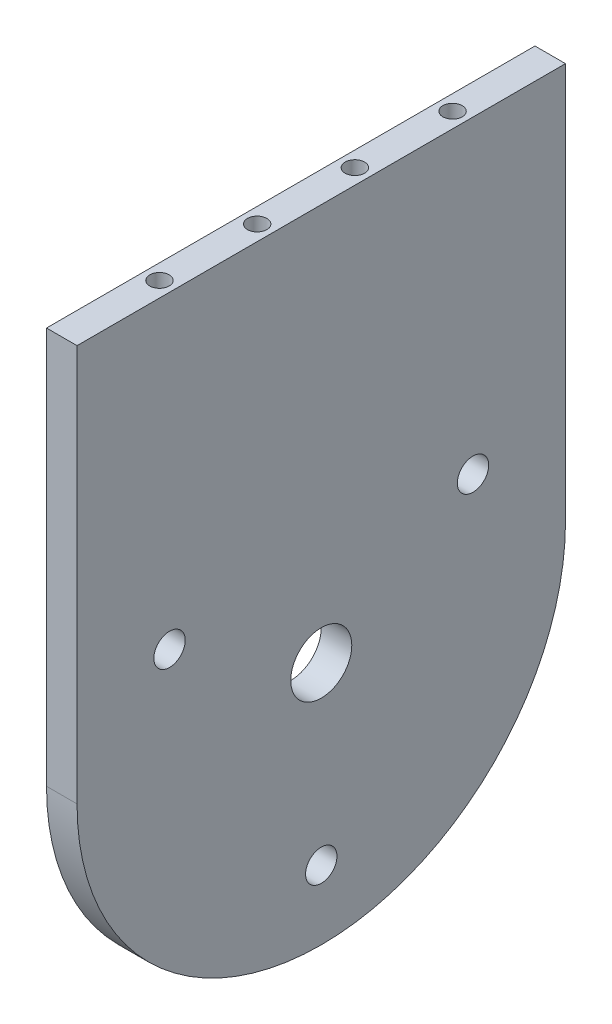
ISO-10303-21;
HEADER;
FILE_DESCRIPTION(('STEP AP214'),'2;1');
FILE_NAME('part.step','',(''),(''),'','','');
FILE_SCHEMA(('AUTOMOTIVE_DESIGN { 1 0 10303 214 1 1 1 1 }'));
ENDSEC;
DATA;
#1=APPLICATION_CONTEXT('core data for automotive mechanical design processes');
#2=APPLICATION_PROTOCOL_DEFINITION('international standard','automotive_design',2000,#1);
#3=PRODUCT_CONTEXT('',#1,'mechanical');
#4=PRODUCT('Part','Part','',(#3));
#5=PRODUCT_RELATED_PRODUCT_CATEGORY('part','',(#4));
#6=PRODUCT_DEFINITION_FORMATION('','',#4);
#7=PRODUCT_DEFINITION_CONTEXT('part definition',#1,'design');
#8=PRODUCT_DEFINITION('design','',#6,#7);
#9=PRODUCT_DEFINITION_SHAPE('','',#8);
#10=(LENGTH_UNIT() NAMED_UNIT(*) SI_UNIT(.MILLI.,.METRE.));
#11=(NAMED_UNIT(*) PLANE_ANGLE_UNIT() SI_UNIT($,.RADIAN.));
#12=(NAMED_UNIT(*) SI_UNIT($,.STERADIAN.) SOLID_ANGLE_UNIT());
#13=UNCERTAINTY_MEASURE_WITH_UNIT(LENGTH_MEASURE(1.E-05),#10,'distance_accuracy_value','');
#14=(GEOMETRIC_REPRESENTATION_CONTEXT(3) GLOBAL_UNCERTAINTY_ASSIGNED_CONTEXT((#13)) GLOBAL_UNIT_ASSIGNED_CONTEXT((#10,
#11,#12)) REPRESENTATION_CONTEXT('',''));
#15=CARTESIAN_POINT('',(0.,0.,0.));
#16=DIRECTION('',(0.,0.,1.));
#17=DIRECTION('',(1.,0.,0.));
#18=AXIS2_PLACEMENT_3D('',#15,#16,#17);
#19=CARTESIAN_POINT('',(3.175,-82.55,0.));
#20=DIRECTION('',(1.,0.,0.));
#21=DIRECTION('',(0.,0.,-1.));
#22=AXIS2_PLACEMENT_3D('',#19,#20,#21);
#23=PLANE('',#22);
#24=CARTESIAN_POINT('',(3.175,-64.3280399904669,31.5613605500002));
#25=DIRECTION('',(1.,0.,0.));
#26=DIRECTION('',(0.,0.,-1.));
#27=AXIS2_PLACEMENT_3D('',#24,#25,#26);
#28=CIRCLE('',#27,3.2639);
#29=CARTESIAN_POINT('',(3.175,-64.3280399904669,28.2974605500002));
#30=VERTEX_POINT('',#29);
#31=EDGE_CURVE('E129',#30,#30,#28,.T.);
#32=ORIENTED_EDGE('',*,*,#31,.F.);
#33=EDGE_LOOP('',(#32));
#34=FACE_BOUND('',#33,.T.);
#35=CARTESIAN_POINT('',(3.175,-64.3280399904667,-31.5613605499998));
#36=DIRECTION('',(1.,0.,0.));
#37=DIRECTION('',(0.,0.,-1.));
#38=AXIS2_PLACEMENT_3D('',#35,#36,#37);
#39=CIRCLE('',#38,3.2639);
#40=CARTESIAN_POINT('',(3.175,-64.3280399904667,-34.8252605499998));
#41=VERTEX_POINT('',#40);
#42=EDGE_CURVE('E135',#41,#41,#39,.T.);
#43=ORIENTED_EDGE('',*,*,#42,.F.);
#44=EDGE_LOOP('',(#43));
#45=FACE_BOUND('',#44,.T.);
#46=CARTESIAN_POINT('',(3.175,-118.993920019067,0.));
#47=DIRECTION('',(1.,0.,0.));
#48=DIRECTION('',(0.,0.,-1.));
#49=AXIS2_PLACEMENT_3D('',#46,#47,#48);
#50=CIRCLE('',#49,3.2639);
#51=CARTESIAN_POINT('',(3.175,-118.993920019067,-3.2639));
#52=VERTEX_POINT('',#51);
#53=EDGE_CURVE('E141',#52,#52,#50,.T.);
#54=ORIENTED_EDGE('',*,*,#53,.F.);
#55=EDGE_LOOP('',(#54));
#56=FACE_BOUND('',#55,.T.);
#57=DIRECTION('',(0.,-1.,0.));
#58=VECTOR('',#57,1.);
#59=CARTESIAN_POINT('',(3.175,0.,50.8));
#60=LINE('',#59,#58);
#61=CARTESIAN_POINT('',(3.175,0.,50.8));
#62=VERTEX_POINT('',#61);
#63=CARTESIAN_POINT('',(3.175,-82.55,50.8));
#64=VERTEX_POINT('',#63);
#65=EDGE_CURVE('E154',#62,#64,#60,.T.);
#66=ORIENTED_EDGE('',*,*,#65,.T.);
#67=CARTESIAN_POINT('',(3.175,-82.55,0.));
#68=DIRECTION('',(1.,0.,0.));
#69=DIRECTION('',(0.,0.,-1.));
#70=AXIS2_PLACEMENT_3D('',#67,#68,#69);
#71=CIRCLE('',#70,50.8);
#72=CARTESIAN_POINT('',(3.175,-82.55,-50.8));
#73=VERTEX_POINT('',#72);
#74=EDGE_CURVE('E83',#64,#73,#71,.T.);
#75=ORIENTED_EDGE('',*,*,#74,.T.);
#76=DIRECTION('',(0.,1.,0.));
#77=VECTOR('',#76,1.);
#78=CARTESIAN_POINT('',(3.175,0.,-50.8));
#79=LINE('',#78,#77);
#80=CARTESIAN_POINT('',(3.175,0.,-50.8));
#81=VERTEX_POINT('',#80);
#82=EDGE_CURVE('E157',#73,#81,#79,.T.);
#83=ORIENTED_EDGE('',*,*,#82,.T.);
#84=DIRECTION('',(0.,0.,1.));
#85=VECTOR('',#84,1.);
#86=CARTESIAN_POINT('',(3.175,0.,50.8));
#87=LINE('',#86,#85);
#88=EDGE_CURVE('E52',#81,#62,#87,.T.);
#89=ORIENTED_EDGE('',*,*,#88,.T.);
#90=EDGE_LOOP('',(#66,#75,#83,#89));
#91=FACE_BOUND('',#90,.T.);
#92=CARTESIAN_POINT('',(3.175,-82.55,0.));
#93=DIRECTION('',(1.,0.,0.));
#94=DIRECTION('',(0.,0.,-1.));
#95=AXIS2_PLACEMENT_3D('',#92,#93,#94);
#96=CIRCLE('',#95,6.34999999999999);
#97=CARTESIAN_POINT('',(3.175,-82.55,-6.34999999999999));
#98=VERTEX_POINT('',#97);
#99=EDGE_CURVE('E148',#98,#98,#96,.T.);
#100=ORIENTED_EDGE('',*,*,#99,.F.);
#101=EDGE_LOOP('',(#100));
#102=FACE_BOUND('',#101,.T.);
#103=ADVANCED_FACE('F35',(#34,#45,#56,#91,#102),#23,.T.);
#104=CARTESIAN_POINT('',(-3.175,-82.55,0.));
#105=DIRECTION('',(1.,0.,0.));
#106=DIRECTION('',(0.,0.,-1.));
#107=AXIS2_PLACEMENT_3D('',#104,#105,#106);
#108=PLANE('',#107);
#109=CARTESIAN_POINT('',(-3.175,-64.3280399904669,31.5613605500002));
#110=DIRECTION('',(1.,0.,0.));
#111=DIRECTION('',(0.,0.,-1.));
#112=AXIS2_PLACEMENT_3D('',#109,#110,#111);
#113=CIRCLE('',#112,3.2639);
#114=CARTESIAN_POINT('',(-3.175,-64.3280399904669,28.2974605500002));
#115=VERTEX_POINT('',#114);
#116=EDGE_CURVE('E132',#115,#115,#113,.T.);
#117=ORIENTED_EDGE('',*,*,#116,.T.);
#118=EDGE_LOOP('',(#117));
#119=FACE_BOUND('',#118,.T.);
#120=CARTESIAN_POINT('',(-3.175,-64.3280399904667,-31.5613605499998));
#121=DIRECTION('',(1.,0.,0.));
#122=DIRECTION('',(0.,0.,-1.));
#123=AXIS2_PLACEMENT_3D('',#120,#121,#122);
#124=CIRCLE('',#123,3.2639);
#125=CARTESIAN_POINT('',(-3.175,-64.3280399904667,-34.8252605499998));
#126=VERTEX_POINT('',#125);
#127=EDGE_CURVE('E138',#126,#126,#124,.T.);
#128=ORIENTED_EDGE('',*,*,#127,.T.);
#129=EDGE_LOOP('',(#128));
#130=FACE_BOUND('',#129,.T.);
#131=CARTESIAN_POINT('',(-3.175,-118.993920019067,0.));
#132=DIRECTION('',(1.,0.,0.));
#133=DIRECTION('',(0.,0.,-1.));
#134=AXIS2_PLACEMENT_3D('',#131,#132,#133);
#135=CIRCLE('',#134,3.2639);
#136=CARTESIAN_POINT('',(-3.175,-118.993920019067,-3.2639));
#137=VERTEX_POINT('',#136);
#138=EDGE_CURVE('E144',#137,#137,#135,.T.);
#139=ORIENTED_EDGE('',*,*,#138,.T.);
#140=EDGE_LOOP('',(#139));
#141=FACE_BOUND('',#140,.T.);
#142=DIRECTION('',(0.,-1.,0.));
#143=VECTOR('',#142,1.);
#144=CARTESIAN_POINT('',(-3.175,0.,50.8));
#145=LINE('',#144,#143);
#146=CARTESIAN_POINT('',(-3.175,0.,50.8));
#147=VERTEX_POINT('',#146);
#148=CARTESIAN_POINT('',(-3.175,-82.55,50.8));
#149=VERTEX_POINT('',#148);
#150=EDGE_CURVE('E151',#147,#149,#145,.T.);
#151=ORIENTED_EDGE('',*,*,#150,.F.);
#152=DIRECTION('',(0.,0.,1.));
#153=VECTOR('',#152,1.);
#154=CARTESIAN_POINT('',(-3.175,0.,50.8));
#155=LINE('',#154,#153);
#156=CARTESIAN_POINT('',(-3.175,0.,-50.8));
#157=VERTEX_POINT('',#156);
#158=EDGE_CURVE('E76',#157,#147,#155,.T.);
#159=ORIENTED_EDGE('',*,*,#158,.F.);
#160=DIRECTION('',(0.,1.,0.));
#161=VECTOR('',#160,1.);
#162=CARTESIAN_POINT('',(-3.175,0.,-50.8));
#163=LINE('',#162,#161);
#164=CARTESIAN_POINT('',(-3.175,-82.55,-50.8));
#165=VERTEX_POINT('',#164);
#166=EDGE_CURVE('E70',#165,#157,#163,.T.);
#167=ORIENTED_EDGE('',*,*,#166,.F.);
#168=CARTESIAN_POINT('',(-3.175,-82.55,0.));
#169=DIRECTION('',(1.,0.,0.));
#170=DIRECTION('',(0.,0.,-1.));
#171=AXIS2_PLACEMENT_3D('',#168,#169,#170);
#172=CIRCLE('',#171,50.8);
#173=EDGE_CURVE('E163',#149,#165,#172,.T.);
#174=ORIENTED_EDGE('',*,*,#173,.F.);
#175=EDGE_LOOP('',(#151,#159,#167,#174));
#176=FACE_BOUND('',#175,.T.);
#177=CARTESIAN_POINT('',(-3.175,-82.55,0.));
#178=DIRECTION('',(1.,0.,0.));
#179=DIRECTION('',(0.,0.,-1.));
#180=AXIS2_PLACEMENT_3D('',#177,#178,#179);
#181=CIRCLE('',#180,6.34999999999999);
#182=CARTESIAN_POINT('',(-3.175,-82.55,-6.34999999999999));
#183=VERTEX_POINT('',#182);
#184=EDGE_CURVE('E147',#183,#183,#181,.T.);
#185=ORIENTED_EDGE('',*,*,#184,.T.);
#186=EDGE_LOOP('',(#185));
#187=FACE_BOUND('',#186,.T.);
#188=ADVANCED_FACE('F173',(#119,#130,#141,#176,#187),#108,.F.);
#189=CARTESIAN_POINT('',(3.175,0.,50.8));
#190=DIRECTION('',(0.,0.,-1.));
#191=DIRECTION('',(0.,1.,0.));
#192=AXIS2_PLACEMENT_3D('',#189,#190,#191);
#193=PLANE('',#192);
#194=ORIENTED_EDGE('',*,*,#150,.T.);
#195=DIRECTION('',(-1.,0.,0.));
#196=VECTOR('',#195,1.);
#197=CARTESIAN_POINT('',(3.175,-82.55,50.8));
#198=LINE('',#197,#196);
#199=EDGE_CURVE('E11',#64,#149,#198,.T.);
#200=ORIENTED_EDGE('',*,*,#199,.F.);
#201=ORIENTED_EDGE('',*,*,#65,.F.);
#202=DIRECTION('',(-1.,0.,0.));
#203=VECTOR('',#202,1.);
#204=CARTESIAN_POINT('',(3.175,0.,50.8));
#205=LINE('',#204,#203);
#206=EDGE_CURVE('E160',#62,#147,#205,.T.);
#207=ORIENTED_EDGE('',*,*,#206,.T.);
#208=EDGE_LOOP('',(#194,#200,#201,#207));
#209=FACE_BOUND('',#208,.T.);
#210=ADVANCED_FACE('F37',(#209),#193,.F.);
#211=CARTESIAN_POINT('',(3.175,-82.55,0.));
#212=DIRECTION('',(-1.,0.,0.));
#213=DIRECTION('',(0.,0.,1.));
#214=AXIS2_PLACEMENT_3D('',#211,#212,#213);
#215=CYLINDRICAL_SURFACE('',#214,50.8);
#216=ORIENTED_EDGE('',*,*,#173,.T.);
#217=DIRECTION('',(-1.,0.,0.));
#218=VECTOR('',#217,1.);
#219=CARTESIAN_POINT('',(3.175,-82.55,-50.8));
#220=LINE('',#219,#218);
#221=EDGE_CURVE('E44',#73,#165,#220,.T.);
#222=ORIENTED_EDGE('',*,*,#221,.F.);
#223=ORIENTED_EDGE('',*,*,#74,.F.);
#224=ORIENTED_EDGE('',*,*,#199,.T.);
#225=EDGE_LOOP('',(#216,#222,#223,#224));
#226=FACE_BOUND('',#225,.T.);
#227=ADVANCED_FACE('F190',(#226),#215,.T.);
#228=CARTESIAN_POINT('',(3.175,0.,-50.8));
#229=DIRECTION('',(0.,0.,1.));
#230=DIRECTION('',(0.,-1.,0.));
#231=AXIS2_PLACEMENT_3D('',#228,#229,#230);
#232=PLANE('',#231);
#233=ORIENTED_EDGE('',*,*,#166,.T.);
#234=DIRECTION('',(-1.,0.,0.));
#235=VECTOR('',#234,1.);
#236=CARTESIAN_POINT('',(3.175,0.,-50.8));
#237=LINE('',#236,#235);
#238=EDGE_CURVE('E168',#81,#157,#237,.T.);
#239=ORIENTED_EDGE('',*,*,#238,.F.);
#240=ORIENTED_EDGE('',*,*,#82,.F.);
#241=ORIENTED_EDGE('',*,*,#221,.T.);
#242=EDGE_LOOP('',(#233,#239,#240,#241));
#243=FACE_BOUND('',#242,.T.);
#244=ADVANCED_FACE('F170',(#243),#232,.F.);
#245=CARTESIAN_POINT('',(3.175,0.,50.8));
#246=DIRECTION('',(0.,-1.,0.));
#247=DIRECTION('',(0.,0.,-1.));
#248=AXIS2_PLACEMENT_3D('',#245,#246,#247);
#249=PLANE('',#248);
#250=CARTESIAN_POINT('',(0.,0.,-30.48));
#251=DIRECTION('',(0.,1.,0.));
#252=DIRECTION('',(0.,0.,1.));
#253=AXIS2_PLACEMENT_3D('',#250,#251,#252);
#254=CIRCLE('',#253,2.01929999999999);
#255=CARTESIAN_POINT('',(0.,0.,-28.4607));
#256=VERTEX_POINT('',#255);
#257=EDGE_CURVE('E107',#256,#256,#254,.T.);
#258=ORIENTED_EDGE('',*,*,#257,.F.);
#259=EDGE_LOOP('',(#258));
#260=FACE_BOUND('',#259,.T.);
#261=CARTESIAN_POINT('',(0.,0.,-10.16));
#262=DIRECTION('',(0.,1.,0.));
#263=DIRECTION('',(0.,0.,1.));
#264=AXIS2_PLACEMENT_3D('',#261,#262,#263);
#265=CIRCLE('',#264,2.01929999999999);
#266=CARTESIAN_POINT('',(0.,0.,-8.14070000000001));
#267=VERTEX_POINT('',#266);
#268=EDGE_CURVE('E106',#267,#267,#265,.T.);
#269=ORIENTED_EDGE('',*,*,#268,.F.);
#270=EDGE_LOOP('',(#269));
#271=FACE_BOUND('',#270,.T.);
#272=CARTESIAN_POINT('',(0.,0.,10.16));
#273=DIRECTION('',(0.,1.,0.));
#274=DIRECTION('',(0.,0.,1.));
#275=AXIS2_PLACEMENT_3D('',#272,#273,#274);
#276=CIRCLE('',#275,2.01929999999999);
#277=CARTESIAN_POINT('',(0.,0.,12.1793));
#278=VERTEX_POINT('',#277);
#279=EDGE_CURVE('E117',#278,#278,#276,.T.);
#280=ORIENTED_EDGE('',*,*,#279,.F.);
#281=EDGE_LOOP('',(#280));
#282=FACE_BOUND('',#281,.T.);
#283=CARTESIAN_POINT('',(0.,0.,30.48));
#284=DIRECTION('',(0.,1.,0.));
#285=DIRECTION('',(0.,0.,1.));
#286=AXIS2_PLACEMENT_3D('',#283,#284,#285);
#287=CIRCLE('',#286,2.01929999999999);
#288=CARTESIAN_POINT('',(0.,0.,32.4993));
#289=VERTEX_POINT('',#288);
#290=EDGE_CURVE('E123',#289,#289,#287,.T.);
#291=ORIENTED_EDGE('',*,*,#290,.F.);
#292=EDGE_LOOP('',(#291));
#293=FACE_BOUND('',#292,.T.);
#294=ORIENTED_EDGE('',*,*,#158,.T.);
#295=ORIENTED_EDGE('',*,*,#206,.F.);
#296=ORIENTED_EDGE('',*,*,#88,.F.);
#297=ORIENTED_EDGE('',*,*,#238,.T.);
#298=EDGE_LOOP('',(#294,#295,#296,#297));
#299=FACE_BOUND('',#298,.T.);
#300=ADVANCED_FACE('F178',(#260,#271,#282,#293,#299),#249,.F.);
#301=CARTESIAN_POINT('',(3.175,-82.55,0.));
#302=DIRECTION('',(-1.,0.,0.));
#303=DIRECTION('',(0.,0.,1.));
#304=AXIS2_PLACEMENT_3D('',#301,#302,#303);
#305=CYLINDRICAL_SURFACE('',#304,6.34999999999999);
#306=ORIENTED_EDGE('',*,*,#99,.T.);
#307=EDGE_LOOP('',(#306));
#308=FACE_BOUND('',#307,.T.);
#309=ORIENTED_EDGE('',*,*,#184,.F.);
#310=EDGE_LOOP('',(#309));
#311=FACE_BOUND('',#310,.T.);
#312=ADVANCED_FACE('F180',(#308,#311),#305,.F.);
#313=CARTESIAN_POINT('',(3.175,-118.993920019067,0.));
#314=DIRECTION('',(1.,0.,0.));
#315=DIRECTION('',(0.,0.,-1.));
#316=AXIS2_PLACEMENT_3D('',#313,#314,#315);
#317=CYLINDRICAL_SURFACE('',#316,3.2639);
#318=ORIENTED_EDGE('',*,*,#138,.F.);
#319=EDGE_LOOP('',(#318));
#320=FACE_BOUND('',#319,.T.);
#321=ORIENTED_EDGE('',*,*,#53,.T.);
#322=EDGE_LOOP('',(#321));
#323=FACE_BOUND('',#322,.T.);
#324=ADVANCED_FACE('F187',(#320,#323),#317,.F.);
#325=CARTESIAN_POINT('',(3.175,-64.3280399904667,-31.5613605499998));
#326=DIRECTION('',(1.,0.,0.));
#327=DIRECTION('',(0.,0.,-1.));
#328=AXIS2_PLACEMENT_3D('',#325,#326,#327);
#329=CYLINDRICAL_SURFACE('',#328,3.2639);
#330=ORIENTED_EDGE('',*,*,#127,.F.);
#331=EDGE_LOOP('',(#330));
#332=FACE_BOUND('',#331,.T.);
#333=ORIENTED_EDGE('',*,*,#42,.T.);
#334=EDGE_LOOP('',(#333));
#335=FACE_BOUND('',#334,.T.);
#336=ADVANCED_FACE('F207',(#332,#335),#329,.F.);
#337=CARTESIAN_POINT('',(3.175,-64.3280399904669,31.5613605500002));
#338=DIRECTION('',(1.,0.,0.));
#339=DIRECTION('',(0.,0.,-1.));
#340=AXIS2_PLACEMENT_3D('',#337,#338,#339);
#341=CYLINDRICAL_SURFACE('',#340,3.2639);
#342=ORIENTED_EDGE('',*,*,#116,.F.);
#343=EDGE_LOOP('',(#342));
#344=FACE_BOUND('',#343,.T.);
#345=ORIENTED_EDGE('',*,*,#31,.T.);
#346=EDGE_LOOP('',(#345));
#347=FACE_BOUND('',#346,.T.);
#348=ADVANCED_FACE('F211',(#344,#347),#341,.F.);
#349=CARTESIAN_POINT('',(0.,-12.7,30.48));
#350=DIRECTION('',(0.,1.,0.));
#351=DIRECTION('',(0.,0.,1.));
#352=AXIS2_PLACEMENT_3D('',#349,#350,#351);
#353=CONICAL_SURFACE('',#352,2.0193,1.02974425867665);
#354=CARTESIAN_POINT('',(0.,-13.9133178480024,30.48));
#355=VERTEX_POINT('',#354);
#356=VERTEX_LOOP('',#355);
#357=FACE_BOUND('',#356,.T.);
#358=CARTESIAN_POINT('',(0.,-12.7,30.48));
#359=DIRECTION('',(0.,1.,0.));
#360=DIRECTION('',(0.,0.,1.));
#361=AXIS2_PLACEMENT_3D('',#358,#359,#360);
#362=CIRCLE('',#361,2.0193);
#363=CARTESIAN_POINT('',(0.,-12.7,32.4993));
#364=VERTEX_POINT('',#363);
#365=EDGE_CURVE('E126',#364,#364,#362,.T.);
#366=ORIENTED_EDGE('',*,*,#365,.T.);
#367=EDGE_LOOP('',(#366));
#368=FACE_BOUND('',#367,.T.);
#369=ADVANCED_FACE('F215',(#357,#368),#353,.F.);
#370=CARTESIAN_POINT('',(0.,0.,30.48));
#371=DIRECTION('',(0.,1.,0.));
#372=DIRECTION('',(0.,0.,1.));
#373=AXIS2_PLACEMENT_3D('',#370,#371,#372);
#374=CYLINDRICAL_SURFACE('',#373,2.01929999999999);
#375=ORIENTED_EDGE('',*,*,#365,.F.);
#376=EDGE_LOOP('',(#375));
#377=FACE_BOUND('',#376,.T.);
#378=ORIENTED_EDGE('',*,*,#290,.T.);
#379=EDGE_LOOP('',(#378));
#380=FACE_BOUND('',#379,.T.);
#381=ADVANCED_FACE('F219',(#377,#380),#374,.F.);
#382=CARTESIAN_POINT('',(0.,-12.7,10.16));
#383=DIRECTION('',(0.,1.,0.));
#384=DIRECTION('',(0.,0.,1.));
#385=AXIS2_PLACEMENT_3D('',#382,#383,#384);
#386=CONICAL_SURFACE('',#385,2.0193,1.02974425867665);
#387=CARTESIAN_POINT('',(0.,-13.9133178480024,10.16));
#388=VERTEX_POINT('',#387);
#389=VERTEX_LOOP('',#388);
#390=FACE_BOUND('',#389,.T.);
#391=CARTESIAN_POINT('',(0.,-12.7,10.16));
#392=DIRECTION('',(0.,1.,0.));
#393=DIRECTION('',(0.,0.,1.));
#394=AXIS2_PLACEMENT_3D('',#391,#392,#393);
#395=CIRCLE('',#394,2.0193);
#396=CARTESIAN_POINT('',(0.,-12.7,12.1793));
#397=VERTEX_POINT('',#396);
#398=EDGE_CURVE('E120',#397,#397,#395,.T.);
#399=ORIENTED_EDGE('',*,*,#398,.T.);
#400=EDGE_LOOP('',(#399));
#401=FACE_BOUND('',#400,.T.);
#402=ADVANCED_FACE('F223',(#390,#401),#386,.F.);
#403=CARTESIAN_POINT('',(0.,0.,10.16));
#404=DIRECTION('',(0.,1.,0.));
#405=DIRECTION('',(0.,0.,1.));
#406=AXIS2_PLACEMENT_3D('',#403,#404,#405);
#407=CYLINDRICAL_SURFACE('',#406,2.01929999999999);
#408=ORIENTED_EDGE('',*,*,#398,.F.);
#409=EDGE_LOOP('',(#408));
#410=FACE_BOUND('',#409,.T.);
#411=ORIENTED_EDGE('',*,*,#279,.T.);
#412=EDGE_LOOP('',(#411));
#413=FACE_BOUND('',#412,.T.);
#414=ADVANCED_FACE('F227',(#410,#413),#407,.F.);
#415=CARTESIAN_POINT('',(0.,-12.7,-10.16));
#416=DIRECTION('',(0.,1.,0.));
#417=DIRECTION('',(0.,0.,1.));
#418=AXIS2_PLACEMENT_3D('',#415,#416,#417);
#419=CONICAL_SURFACE('',#418,2.0193,1.02974425867665);
#420=CARTESIAN_POINT('',(0.,-13.9133178480024,-10.16));
#421=VERTEX_POINT('',#420);
#422=VERTEX_LOOP('',#421);
#423=FACE_BOUND('',#422,.T.);
#424=CARTESIAN_POINT('',(0.,-12.7,-10.16));
#425=DIRECTION('',(0.,1.,0.));
#426=DIRECTION('',(0.,0.,1.));
#427=AXIS2_PLACEMENT_3D('',#424,#425,#426);
#428=CIRCLE('',#427,2.0193);
#429=CARTESIAN_POINT('',(0.,-12.7,-8.1407));
#430=VERTEX_POINT('',#429);
#431=EDGE_CURVE('E110',#430,#430,#428,.T.);
#432=ORIENTED_EDGE('',*,*,#431,.T.);
#433=EDGE_LOOP('',(#432));
#434=FACE_BOUND('',#433,.T.);
#435=ADVANCED_FACE('F231',(#423,#434),#419,.F.);
#436=CARTESIAN_POINT('',(0.,0.,-10.16));
#437=DIRECTION('',(0.,1.,0.));
#438=DIRECTION('',(0.,0.,1.));
#439=AXIS2_PLACEMENT_3D('',#436,#437,#438);
#440=CYLINDRICAL_SURFACE('',#439,2.01929999999999);
#441=ORIENTED_EDGE('',*,*,#431,.F.);
#442=EDGE_LOOP('',(#441));
#443=FACE_BOUND('',#442,.T.);
#444=ORIENTED_EDGE('',*,*,#268,.T.);
#445=EDGE_LOOP('',(#444));
#446=FACE_BOUND('',#445,.T.);
#447=ADVANCED_FACE('F100',(#443,#446),#440,.F.);
#448=CARTESIAN_POINT('',(0.,-12.7,-30.48));
#449=DIRECTION('',(0.,1.,0.));
#450=DIRECTION('',(0.,0.,1.));
#451=AXIS2_PLACEMENT_3D('',#448,#449,#450);
#452=CONICAL_SURFACE('',#451,2.0193,1.02974425867665);
#453=CARTESIAN_POINT('',(0.,-13.9133178480024,-30.48));
#454=VERTEX_POINT('',#453);
#455=VERTEX_LOOP('',#454);
#456=FACE_BOUND('',#455,.T.);
#457=CARTESIAN_POINT('',(0.,-12.7,-30.48));
#458=DIRECTION('',(0.,1.,0.));
#459=DIRECTION('',(0.,0.,1.));
#460=AXIS2_PLACEMENT_3D('',#457,#458,#459);
#461=CIRCLE('',#460,2.0193);
#462=CARTESIAN_POINT('',(0.,-12.7,-28.4607));
#463=VERTEX_POINT('',#462);
#464=EDGE_CURVE('E104',#463,#463,#461,.T.);
#465=ORIENTED_EDGE('',*,*,#464,.T.);
#466=EDGE_LOOP('',(#465));
#467=FACE_BOUND('',#466,.T.);
#468=ADVANCED_FACE('F96',(#456,#467),#452,.F.);
#469=CARTESIAN_POINT('',(0.,0.,-30.48));
#470=DIRECTION('',(0.,1.,0.));
#471=DIRECTION('',(0.,0.,1.));
#472=AXIS2_PLACEMENT_3D('',#469,#470,#471);
#473=CYLINDRICAL_SURFACE('',#472,2.01929999999999);
#474=ORIENTED_EDGE('',*,*,#464,.F.);
#475=EDGE_LOOP('',(#474));
#476=FACE_BOUND('',#475,.T.);
#477=ORIENTED_EDGE('',*,*,#257,.T.);
#478=EDGE_LOOP('',(#477));
#479=FACE_BOUND('',#478,.T.);
#480=ADVANCED_FACE('F99',(#476,#479),#473,.F.);
#481=CLOSED_SHELL('',(#103,#188,#210,#227,#244,#300,#312,#324,#336,#348,#369,#381,#402,#414,
#435,#447,#468,#480));
#482=MANIFOLD_SOLID_BREP('B2',#481);
#483=ADVANCED_BREP_SHAPE_REPRESENTATION('',(#18,#482),#14);
#484=SHAPE_DEFINITION_REPRESENTATION(#9,#483);
ENDSEC;
END-ISO-10303-21;
